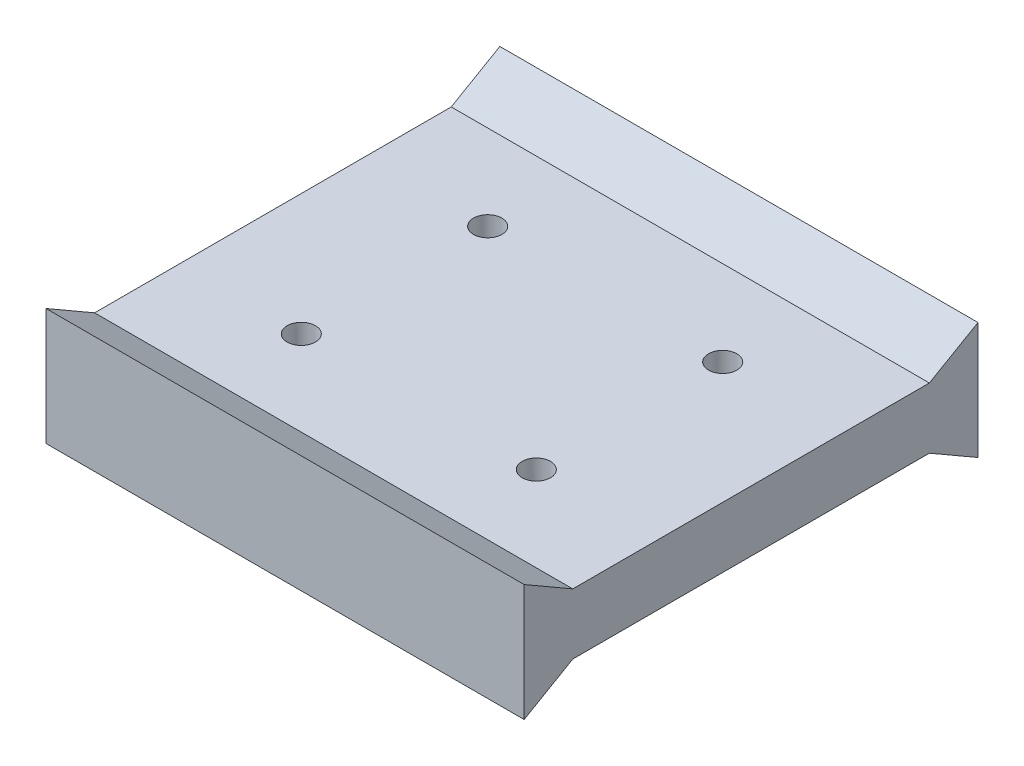
ISO-10303-21;
HEADER;
FILE_DESCRIPTION(('STEP AP214'),'2;1');
FILE_NAME('part.step','',(''),(''),'','','');
FILE_SCHEMA(('AUTOMOTIVE_DESIGN { 1 0 10303 214 1 1 1 1 }'));
ENDSEC;
DATA;
#1=APPLICATION_CONTEXT('core data for automotive mechanical design processes');
#2=APPLICATION_PROTOCOL_DEFINITION('international standard','automotive_design',2000,#1);
#3=PRODUCT_CONTEXT('',#1,'mechanical');
#4=PRODUCT('Part','Part','',(#3));
#5=PRODUCT_RELATED_PRODUCT_CATEGORY('part','',(#4));
#6=PRODUCT_DEFINITION_FORMATION('','',#4);
#7=PRODUCT_DEFINITION_CONTEXT('part definition',#1,'design');
#8=PRODUCT_DEFINITION('design','',#6,#7);
#9=PRODUCT_DEFINITION_SHAPE('','',#8);
#10=(LENGTH_UNIT() NAMED_UNIT(*) SI_UNIT(.MILLI.,.METRE.));
#11=(NAMED_UNIT(*) PLANE_ANGLE_UNIT() SI_UNIT($,.RADIAN.));
#12=(NAMED_UNIT(*) SI_UNIT($,.STERADIAN.) SOLID_ANGLE_UNIT());
#13=UNCERTAINTY_MEASURE_WITH_UNIT(LENGTH_MEASURE(1.E-05),#10,'distance_accuracy_value','');
#14=(GEOMETRIC_REPRESENTATION_CONTEXT(3) GLOBAL_UNCERTAINTY_ASSIGNED_CONTEXT((#13)) GLOBAL_UNIT_ASSIGNED_CONTEXT((#10,
#11,#12)) REPRESENTATION_CONTEXT('',''));
#15=CARTESIAN_POINT('',(0.,0.,0.));
#16=DIRECTION('',(0.,0.,1.));
#17=DIRECTION('',(1.,0.,0.));
#18=AXIS2_PLACEMENT_3D('',#15,#16,#17);
#19=CARTESIAN_POINT('',(0.,7.5,0.));
#20=DIRECTION('',(0.,-1.,0.));
#21=DIRECTION('',(0.,0.,-1.));
#22=AXIS2_PLACEMENT_3D('',#19,#20,#21);
#23=PLANE('',#22);
#24=DIRECTION('',(0.,0.,1.));
#25=VECTOR('',#24,1.);
#26=CARTESIAN_POINT('',(0.,7.5,0.));
#27=LINE('',#26,#25);
#28=CARTESIAN_POINT('',(0.,7.5,-44.));
#29=VERTEX_POINT('',#28);
#30=CARTESIAN_POINT('',(0.,7.5,0.));
#31=VERTEX_POINT('',#30);
#32=EDGE_CURVE('E92',#29,#31,#27,.T.);
#33=ORIENTED_EDGE('',*,*,#32,.T.);
#34=DIRECTION('',(1.,0.,0.));
#35=VECTOR('',#34,1.);
#36=CARTESIAN_POINT('',(0.,7.5,0.));
#37=LINE('',#36,#35);
#38=CARTESIAN_POINT('',(59.,7.5,0.));
#39=VERTEX_POINT('',#38);
#40=EDGE_CURVE('E89',#31,#39,#37,.T.);
#41=ORIENTED_EDGE('',*,*,#40,.T.);
#42=DIRECTION('',(0.,0.,-1.));
#43=VECTOR('',#42,1.);
#44=CARTESIAN_POINT('',(59.,7.5,0.));
#45=LINE('',#44,#43);
#46=CARTESIAN_POINT('',(59.,7.5,-44.));
#47=VERTEX_POINT('',#46);
#48=EDGE_CURVE('E50',#39,#47,#45,.T.);
#49=ORIENTED_EDGE('',*,*,#48,.T.);
#50=DIRECTION('',(-1.,0.,0.));
#51=VECTOR('',#50,1.);
#52=CARTESIAN_POINT('',(0.,7.5,-44.));
#53=LINE('',#52,#51);
#54=EDGE_CURVE('E11',#47,#29,#53,.T.);
#55=ORIENTED_EDGE('',*,*,#54,.T.);
#56=EDGE_LOOP('',(#33,#41,#49,#55));
#57=FACE_BOUND('',#56,.T.);
#58=CARTESIAN_POINT('',(15.,7.5,-10.5));
#59=DIRECTION('',(0.,1.,0.));
#60=DIRECTION('',(0.,0.,1.));
#61=AXIS2_PLACEMENT_3D('',#58,#59,#60);
#62=CIRCLE('',#61,1.75);
#63=CARTESIAN_POINT('',(15.,7.5,-8.75));
#64=VERTEX_POINT('',#63);
#65=EDGE_CURVE('E168',#64,#64,#62,.T.);
#66=ORIENTED_EDGE('',*,*,#65,.F.);
#67=EDGE_LOOP('',(#66));
#68=FACE_BOUND('',#67,.T.);
#69=CARTESIAN_POINT('',(44.,7.5,-10.5));
#70=DIRECTION('',(0.,1.,0.));
#71=DIRECTION('',(0.,0.,-1.));
#72=AXIS2_PLACEMENT_3D('',#69,#70,#71);
#73=CIRCLE('',#72,1.75);
#74=CARTESIAN_POINT('',(44.,7.5,-12.25));
#75=VERTEX_POINT('',#74);
#76=EDGE_CURVE('E160',#75,#75,#73,.T.);
#77=ORIENTED_EDGE('',*,*,#76,.F.);
#78=EDGE_LOOP('',(#77));
#79=FACE_BOUND('',#78,.T.);
#80=CARTESIAN_POINT('',(15.,7.5,-33.5));
#81=DIRECTION('',(0.,1.,0.));
#82=DIRECTION('',(0.,0.,-1.));
#83=AXIS2_PLACEMENT_3D('',#80,#81,#82);
#84=CIRCLE('',#83,1.75);
#85=CARTESIAN_POINT('',(15.,7.5,-35.25));
#86=VERTEX_POINT('',#85);
#87=EDGE_CURVE('E152',#86,#86,#84,.T.);
#88=ORIENTED_EDGE('',*,*,#87,.F.);
#89=EDGE_LOOP('',(#88));
#90=FACE_BOUND('',#89,.T.);
#91=CARTESIAN_POINT('',(44.,7.5,-33.5));
#92=DIRECTION('',(0.,1.,0.));
#93=DIRECTION('',(0.,0.,1.));
#94=AXIS2_PLACEMENT_3D('',#91,#92,#93);
#95=CIRCLE('',#94,1.75);
#96=CARTESIAN_POINT('',(44.,7.5,-31.75));
#97=VERTEX_POINT('',#96);
#98=EDGE_CURVE('E144',#97,#97,#95,.T.);
#99=ORIENTED_EDGE('',*,*,#98,.F.);
#100=EDGE_LOOP('',(#99));
#101=FACE_BOUND('',#100,.T.);
#102=ADVANCED_FACE('F39',(#57,#68,#79,#90,#101),#23,.F.);
#103=CARTESIAN_POINT('',(0.,0.,0.));
#104=DIRECTION('',(0.,-1.,0.));
#105=DIRECTION('',(0.,0.,-1.));
#106=AXIS2_PLACEMENT_3D('',#103,#104,#105);
#107=PLANE('',#106);
#108=CARTESIAN_POINT('',(15.,0.,-33.5));
#109=DIRECTION('',(0.,1.,0.));
#110=DIRECTION('',(0.,0.,-1.));
#111=AXIS2_PLACEMENT_3D('',#108,#109,#110);
#112=CIRCLE('',#111,1.75);
#113=CARTESIAN_POINT('',(15.,0.,-35.25));
#114=VERTEX_POINT('',#113);
#115=EDGE_CURVE('E148',#114,#114,#112,.T.);
#116=ORIENTED_EDGE('',*,*,#115,.T.);
#117=EDGE_LOOP('',(#116));
#118=FACE_BOUND('',#117,.T.);
#119=CARTESIAN_POINT('',(15.,0.,-10.5));
#120=DIRECTION('',(0.,1.,0.));
#121=DIRECTION('',(0.,0.,1.));
#122=AXIS2_PLACEMENT_3D('',#119,#120,#121);
#123=CIRCLE('',#122,1.75);
#124=CARTESIAN_POINT('',(15.,0.,-8.75));
#125=VERTEX_POINT('',#124);
#126=EDGE_CURVE('E164',#125,#125,#123,.T.);
#127=ORIENTED_EDGE('',*,*,#126,.T.);
#128=EDGE_LOOP('',(#127));
#129=FACE_BOUND('',#128,.T.);
#130=DIRECTION('',(0.,0.,1.));
#131=VECTOR('',#130,1.);
#132=CARTESIAN_POINT('',(0.,0.,0.));
#133=LINE('',#132,#131);
#134=CARTESIAN_POINT('',(0.,0.,-44.));
#135=VERTEX_POINT('',#134);
#136=CARTESIAN_POINT('',(0.,0.,0.));
#137=VERTEX_POINT('',#136);
#138=EDGE_CURVE('E172',#135,#137,#133,.T.);
#139=ORIENTED_EDGE('',*,*,#138,.F.);
#140=DIRECTION('',(-1.,0.,0.));
#141=VECTOR('',#140,1.);
#142=CARTESIAN_POINT('',(0.,0.,-44.));
#143=LINE('',#142,#141);
#144=CARTESIAN_POINT('',(59.,0.,-44.));
#145=VERTEX_POINT('',#144);
#146=EDGE_CURVE('E43',#145,#135,#143,.T.);
#147=ORIENTED_EDGE('',*,*,#146,.F.);
#148=DIRECTION('',(0.,0.,-1.));
#149=VECTOR('',#148,1.);
#150=CARTESIAN_POINT('',(59.,0.,0.));
#151=LINE('',#150,#149);
#152=CARTESIAN_POINT('',(59.,0.,0.));
#153=VERTEX_POINT('',#152);
#154=EDGE_CURVE('E69',#153,#145,#151,.T.);
#155=ORIENTED_EDGE('',*,*,#154,.F.);
#156=DIRECTION('',(1.,0.,0.));
#157=VECTOR('',#156,1.);
#158=CARTESIAN_POINT('',(0.,0.,0.));
#159=LINE('',#158,#157);
#160=EDGE_CURVE('E180',#137,#153,#159,.T.);
#161=ORIENTED_EDGE('',*,*,#160,.F.);
#162=EDGE_LOOP('',(#139,#147,#155,#161));
#163=FACE_BOUND('',#162,.T.);
#164=CARTESIAN_POINT('',(44.,0.,-10.5));
#165=DIRECTION('',(0.,1.,0.));
#166=DIRECTION('',(0.,0.,-1.));
#167=AXIS2_PLACEMENT_3D('',#164,#165,#166);
#168=CIRCLE('',#167,1.75);
#169=CARTESIAN_POINT('',(44.,0.,-12.25));
#170=VERTEX_POINT('',#169);
#171=EDGE_CURVE('E156',#170,#170,#168,.T.);
#172=ORIENTED_EDGE('',*,*,#171,.T.);
#173=EDGE_LOOP('',(#172));
#174=FACE_BOUND('',#173,.T.);
#175=CARTESIAN_POINT('',(44.,0.,-33.5));
#176=DIRECTION('',(0.,1.,0.));
#177=DIRECTION('',(0.,0.,1.));
#178=AXIS2_PLACEMENT_3D('',#175,#176,#177);
#179=CIRCLE('',#178,1.75);
#180=CARTESIAN_POINT('',(44.,0.,-31.75));
#181=VERTEX_POINT('',#180);
#182=EDGE_CURVE('E143',#181,#181,#179,.T.);
#183=ORIENTED_EDGE('',*,*,#182,.T.);
#184=EDGE_LOOP('',(#183));
#185=FACE_BOUND('',#184,.T.);
#186=ADVANCED_FACE('F194',(#118,#129,#163,#174,#185),#107,.T.);
#187=CARTESIAN_POINT('',(0.,7.5,0.));
#188=DIRECTION('',(1.,0.,0.));
#189=DIRECTION('',(0.,0.,-1.));
#190=AXIS2_PLACEMENT_3D('',#187,#188,#189);
#191=PLANE('',#190);
#192=ORIENTED_EDGE('',*,*,#138,.T.);
#193=DIRECTION('',(0.,-0.500000000000001,0.866025403784438));
#194=VECTOR('',#193,1.);
#195=CARTESIAN_POINT('',(0.,-3.46410161513776,6.));
#196=LINE('',#195,#194);
#197=CARTESIAN_POINT('',(0.,-3.46410161513776,6.));
#198=VERTEX_POINT('',#197);
#199=EDGE_CURVE('E80',#137,#198,#196,.T.);
#200=ORIENTED_EDGE('',*,*,#199,.T.);
#201=DIRECTION('',(0.,1.,0.));
#202=VECTOR('',#201,1.);
#203=CARTESIAN_POINT('',(0.,10.9641016151377,6.));
#204=LINE('',#203,#202);
#205=CARTESIAN_POINT('',(0.,10.9641016151377,6.));
#206=VERTEX_POINT('',#205);
#207=EDGE_CURVE('E137',#198,#206,#204,.T.);
#208=ORIENTED_EDGE('',*,*,#207,.T.);
#209=DIRECTION('',(0.,-0.499999999999995,-0.866025403784442));
#210=VECTOR('',#209,1.);
#211=CARTESIAN_POINT('',(0.,7.5,0.));
#212=LINE('',#211,#210);
#213=EDGE_CURVE('E140',#206,#31,#212,.T.);
#214=ORIENTED_EDGE('',*,*,#213,.T.);
#215=ORIENTED_EDGE('',*,*,#32,.F.);
#216=DIRECTION('',(0.,0.499999999999996,-0.866025403784441));
#217=VECTOR('',#216,1.);
#218=CARTESIAN_POINT('',(0.,7.5,-44.));
#219=LINE('',#218,#217);
#220=CARTESIAN_POINT('',(0.,10.9641016151377,-50.));
#221=VERTEX_POINT('',#220);
#222=EDGE_CURVE('E125',#29,#221,#219,.T.);
#223=ORIENTED_EDGE('',*,*,#222,.T.);
#224=DIRECTION('',(0.,-1.,0.));
#225=VECTOR('',#224,1.);
#226=CARTESIAN_POINT('',(0.,10.9641016151377,-50.));
#227=LINE('',#226,#225);
#228=CARTESIAN_POINT('',(0.,-3.46410161513776,-50.));
#229=VERTEX_POINT('',#228);
#230=EDGE_CURVE('E354',#221,#229,#227,.T.);
#231=ORIENTED_EDGE('',*,*,#230,.T.);
#232=DIRECTION('',(0.,0.5,0.866025403784438));
#233=VECTOR('',#232,1.);
#234=CARTESIAN_POINT('',(0.,-3.46410161513776,-50.));
#235=LINE('',#234,#233);
#236=EDGE_CURVE('E118',#229,#135,#235,.T.);
#237=ORIENTED_EDGE('',*,*,#236,.T.);
#238=EDGE_LOOP('',(#192,#200,#208,#214,#215,#223,#231,#237));
#239=FACE_BOUND('',#238,.T.);
#240=ADVANCED_FACE('F41',(#239),#191,.F.);
#241=CARTESIAN_POINT('',(59.,7.5,0.));
#242=DIRECTION('',(-1.,0.,0.));
#243=DIRECTION('',(0.,0.,1.));
#244=AXIS2_PLACEMENT_3D('',#241,#242,#243);
#245=PLANE('',#244);
#246=ORIENTED_EDGE('',*,*,#154,.T.);
#247=DIRECTION('',(0.,-0.5,-0.866025403784438));
#248=VECTOR('',#247,1.);
#249=CARTESIAN_POINT('',(59.,-3.46410161513776,-50.));
#250=LINE('',#249,#248);
#251=CARTESIAN_POINT('',(59.,-3.46410161513776,-50.));
#252=VERTEX_POINT('',#251);
#253=EDGE_CURVE('E193',#145,#252,#250,.T.);
#254=ORIENTED_EDGE('',*,*,#253,.T.);
#255=DIRECTION('',(0.,1.,0.));
#256=VECTOR('',#255,1.);
#257=CARTESIAN_POINT('',(59.,10.9641016151377,-50.));
#258=LINE('',#257,#256);
#259=CARTESIAN_POINT('',(59.,10.9641016151377,-50.));
#260=VERTEX_POINT('',#259);
#261=EDGE_CURVE('E369',#252,#260,#258,.T.);
#262=ORIENTED_EDGE('',*,*,#261,.T.);
#263=DIRECTION('',(0.,-0.499999999999996,0.866025403784441));
#264=VECTOR('',#263,1.);
#265=CARTESIAN_POINT('',(59.,7.5,-44.));
#266=LINE('',#265,#264);
#267=EDGE_CURVE('E108',#260,#47,#266,.T.);
#268=ORIENTED_EDGE('',*,*,#267,.T.);
#269=ORIENTED_EDGE('',*,*,#48,.F.);
#270=DIRECTION('',(0.,0.499999999999995,0.866025403784442));
#271=VECTOR('',#270,1.);
#272=CARTESIAN_POINT('',(59.,7.5,0.));
#273=LINE('',#272,#271);
#274=CARTESIAN_POINT('',(59.,10.9641016151377,6.));
#275=VERTEX_POINT('',#274);
#276=EDGE_CURVE('E105',#39,#275,#273,.T.);
#277=ORIENTED_EDGE('',*,*,#276,.T.);
#278=DIRECTION('',(0.,-1.,0.));
#279=VECTOR('',#278,1.);
#280=CARTESIAN_POINT('',(59.,10.9641016151377,6.));
#281=LINE('',#280,#279);
#282=CARTESIAN_POINT('',(59.,-3.46410161513776,6.));
#283=VERTEX_POINT('',#282);
#284=EDGE_CURVE('E117',#275,#283,#281,.T.);
#285=ORIENTED_EDGE('',*,*,#284,.T.);
#286=DIRECTION('',(0.,0.500000000000001,-0.866025403784438));
#287=VECTOR('',#286,1.);
#288=CARTESIAN_POINT('',(59.,-3.46410161513776,6.));
#289=LINE('',#288,#287);
#290=EDGE_CURVE('E122',#283,#153,#289,.T.);
#291=ORIENTED_EDGE('',*,*,#290,.T.);
#292=EDGE_LOOP('',(#246,#254,#262,#268,#269,#277,#285,#291));
#293=FACE_BOUND('',#292,.T.);
#294=ADVANCED_FACE('F102',(#293),#245,.F.);
#295=CARTESIAN_POINT('',(15.,7.5,-10.5));
#296=DIRECTION('',(0.,-1.,0.));
#297=DIRECTION('',(0.,0.,-1.));
#298=AXIS2_PLACEMENT_3D('',#295,#296,#297);
#299=CYLINDRICAL_SURFACE('',#298,1.75);
#300=ORIENTED_EDGE('',*,*,#65,.T.);
#301=EDGE_LOOP('',(#300));
#302=FACE_BOUND('',#301,.T.);
#303=ORIENTED_EDGE('',*,*,#126,.F.);
#304=EDGE_LOOP('',(#303));
#305=FACE_BOUND('',#304,.T.);
#306=ADVANCED_FACE('F237',(#302,#305),#299,.F.);
#307=CARTESIAN_POINT('',(44.,7.5,-10.5));
#308=DIRECTION('',(0.,-1.,0.));
#309=DIRECTION('',(0.,0.,-1.));
#310=AXIS2_PLACEMENT_3D('',#307,#308,#309);
#311=CYLINDRICAL_SURFACE('',#310,1.75);
#312=ORIENTED_EDGE('',*,*,#76,.T.);
#313=EDGE_LOOP('',(#312));
#314=FACE_BOUND('',#313,.T.);
#315=ORIENTED_EDGE('',*,*,#171,.F.);
#316=EDGE_LOOP('',(#315));
#317=FACE_BOUND('',#316,.T.);
#318=ADVANCED_FACE('F244',(#314,#317),#311,.F.);
#319=CARTESIAN_POINT('',(15.,7.5,-33.5));
#320=DIRECTION('',(0.,-1.,0.));
#321=DIRECTION('',(0.,0.,-1.));
#322=AXIS2_PLACEMENT_3D('',#319,#320,#321);
#323=CYLINDRICAL_SURFACE('',#322,1.75);
#324=ORIENTED_EDGE('',*,*,#87,.T.);
#325=EDGE_LOOP('',(#324));
#326=FACE_BOUND('',#325,.T.);
#327=ORIENTED_EDGE('',*,*,#115,.F.);
#328=EDGE_LOOP('',(#327));
#329=FACE_BOUND('',#328,.T.);
#330=ADVANCED_FACE('F225',(#326,#329),#323,.F.);
#331=CARTESIAN_POINT('',(44.,7.5,-33.5));
#332=DIRECTION('',(0.,-1.,0.));
#333=DIRECTION('',(0.,0.,-1.));
#334=AXIS2_PLACEMENT_3D('',#331,#332,#333);
#335=CYLINDRICAL_SURFACE('',#334,1.75);
#336=ORIENTED_EDGE('',*,*,#98,.T.);
#337=EDGE_LOOP('',(#336));
#338=FACE_BOUND('',#337,.T.);
#339=ORIENTED_EDGE('',*,*,#182,.F.);
#340=EDGE_LOOP('',(#339));
#341=FACE_BOUND('',#340,.T.);
#342=ADVANCED_FACE('F218',(#338,#341),#335,.F.);
#343=CARTESIAN_POINT('',(-15.6260375160861,-3.46410161513776,6.));
#344=DIRECTION('',(0.,-0.866025403784438,-0.500000000000001));
#345=DIRECTION('',(0.,0.500000000000001,-0.866025403784438));
#346=AXIS2_PLACEMENT_3D('',#343,#344,#345);
#347=PLANE('',#346);
#348=ORIENTED_EDGE('',*,*,#199,.F.);
#349=ORIENTED_EDGE('',*,*,#160,.T.);
#350=ORIENTED_EDGE('',*,*,#290,.F.);
#351=DIRECTION('',(1.,0.,0.));
#352=VECTOR('',#351,1.);
#353=CARTESIAN_POINT('',(-15.6260375160861,-3.46410161513776,6.));
#354=LINE('',#353,#352);
#355=EDGE_CURVE('E133',#198,#283,#354,.T.);
#356=ORIENTED_EDGE('',*,*,#355,.F.);
#357=EDGE_LOOP('',(#348,#349,#350,#356));
#358=FACE_BOUND('',#357,.T.);
#359=ADVANCED_FACE('F215',(#358),#347,.T.);
#360=CARTESIAN_POINT('',(-15.6260375160861,10.9641016151377,6.));
#361=DIRECTION('',(0.,0.,1.));
#362=DIRECTION('',(0.,-1.,0.));
#363=AXIS2_PLACEMENT_3D('',#360,#361,#362);
#364=PLANE('',#363);
#365=ORIENTED_EDGE('',*,*,#207,.F.);
#366=ORIENTED_EDGE('',*,*,#355,.T.);
#367=ORIENTED_EDGE('',*,*,#284,.F.);
#368=DIRECTION('',(1.,0.,0.));
#369=VECTOR('',#368,1.);
#370=CARTESIAN_POINT('',(-15.6260375160861,10.9641016151377,6.));
#371=LINE('',#370,#369);
#372=EDGE_CURVE('E114',#206,#275,#371,.T.);
#373=ORIENTED_EDGE('',*,*,#372,.F.);
#374=EDGE_LOOP('',(#365,#366,#367,#373));
#375=FACE_BOUND('',#374,.T.);
#376=ADVANCED_FACE('F212',(#375),#364,.T.);
#377=CARTESIAN_POINT('',(-15.6260375160861,7.5,0.));
#378=DIRECTION('',(0.,0.866025403784442,-0.499999999999995));
#379=DIRECTION('',(0.,0.499999999999995,0.866025403784442));
#380=AXIS2_PLACEMENT_3D('',#377,#378,#379);
#381=PLANE('',#380);
#382=ORIENTED_EDGE('',*,*,#213,.F.);
#383=ORIENTED_EDGE('',*,*,#372,.T.);
#384=ORIENTED_EDGE('',*,*,#276,.F.);
#385=ORIENTED_EDGE('',*,*,#40,.F.);
#386=EDGE_LOOP('',(#382,#383,#384,#385));
#387=FACE_BOUND('',#386,.T.);
#388=ADVANCED_FACE('F112',(#387),#381,.T.);
#389=CARTESIAN_POINT('',(-15.6260375160861,7.5,-44.));
#390=DIRECTION('',(0.,0.866025403784441,0.499999999999996));
#391=DIRECTION('',(0.,-0.499999999999996,0.866025403784441));
#392=AXIS2_PLACEMENT_3D('',#389,#390,#391);
#393=PLANE('',#392);
#394=ORIENTED_EDGE('',*,*,#222,.F.);
#395=ORIENTED_EDGE('',*,*,#54,.F.);
#396=ORIENTED_EDGE('',*,*,#267,.F.);
#397=DIRECTION('',(1.,0.,0.));
#398=VECTOR('',#397,1.);
#399=CARTESIAN_POINT('',(-15.6260375160861,10.9641016151377,-50.));
#400=LINE('',#399,#398);
#401=EDGE_CURVE('E357',#221,#260,#400,.T.);
#402=ORIENTED_EDGE('',*,*,#401,.F.);
#403=EDGE_LOOP('',(#394,#395,#396,#402));
#404=FACE_BOUND('',#403,.T.);
#405=ADVANCED_FACE('F322',(#404),#393,.T.);
#406=CARTESIAN_POINT('',(-15.6260375160861,10.9641016151377,-50.));
#407=DIRECTION('',(0.,0.,-1.));
#408=DIRECTION('',(-1.,0.,0.));
#409=AXIS2_PLACEMENT_3D('',#406,#407,#408);
#410=PLANE('',#409);
#411=ORIENTED_EDGE('',*,*,#230,.F.);
#412=ORIENTED_EDGE('',*,*,#401,.T.);
#413=ORIENTED_EDGE('',*,*,#261,.F.);
#414=DIRECTION('',(1.,0.,0.));
#415=VECTOR('',#414,1.);
#416=CARTESIAN_POINT('',(-15.6260375160861,-3.46410161513776,-50.));
#417=LINE('',#416,#415);
#418=EDGE_CURVE('E358',#229,#252,#417,.T.);
#419=ORIENTED_EDGE('',*,*,#418,.F.);
#420=EDGE_LOOP('',(#411,#412,#413,#419));
#421=FACE_BOUND('',#420,.T.);
#422=ADVANCED_FACE('F330',(#421),#410,.T.);
#423=CARTESIAN_POINT('',(-15.6260375160861,-3.46410161513776,-50.));
#424=DIRECTION('',(0.,-0.866025403784438,0.5));
#425=DIRECTION('',(0.,-0.5,-0.866025403784438));
#426=AXIS2_PLACEMENT_3D('',#423,#424,#425);
#427=PLANE('',#426);
#428=ORIENTED_EDGE('',*,*,#236,.F.);
#429=ORIENTED_EDGE('',*,*,#418,.T.);
#430=ORIENTED_EDGE('',*,*,#253,.F.);
#431=ORIENTED_EDGE('',*,*,#146,.T.);
#432=EDGE_LOOP('',(#428,#429,#430,#431));
#433=FACE_BOUND('',#432,.T.);
#434=ADVANCED_FACE('F190',(#433),#427,.T.);
#435=CLOSED_SHELL('',(#102,#186,#240,#294,#306,#318,#330,#342,#359,#376,#388,#405,#422,#434));
#436=MANIFOLD_SOLID_BREP('B2',#435);
#437=ADVANCED_BREP_SHAPE_REPRESENTATION('',(#18,#436),#14);
#438=SHAPE_DEFINITION_REPRESENTATION(#9,#437);
ENDSEC;
END-ISO-10303-21;
